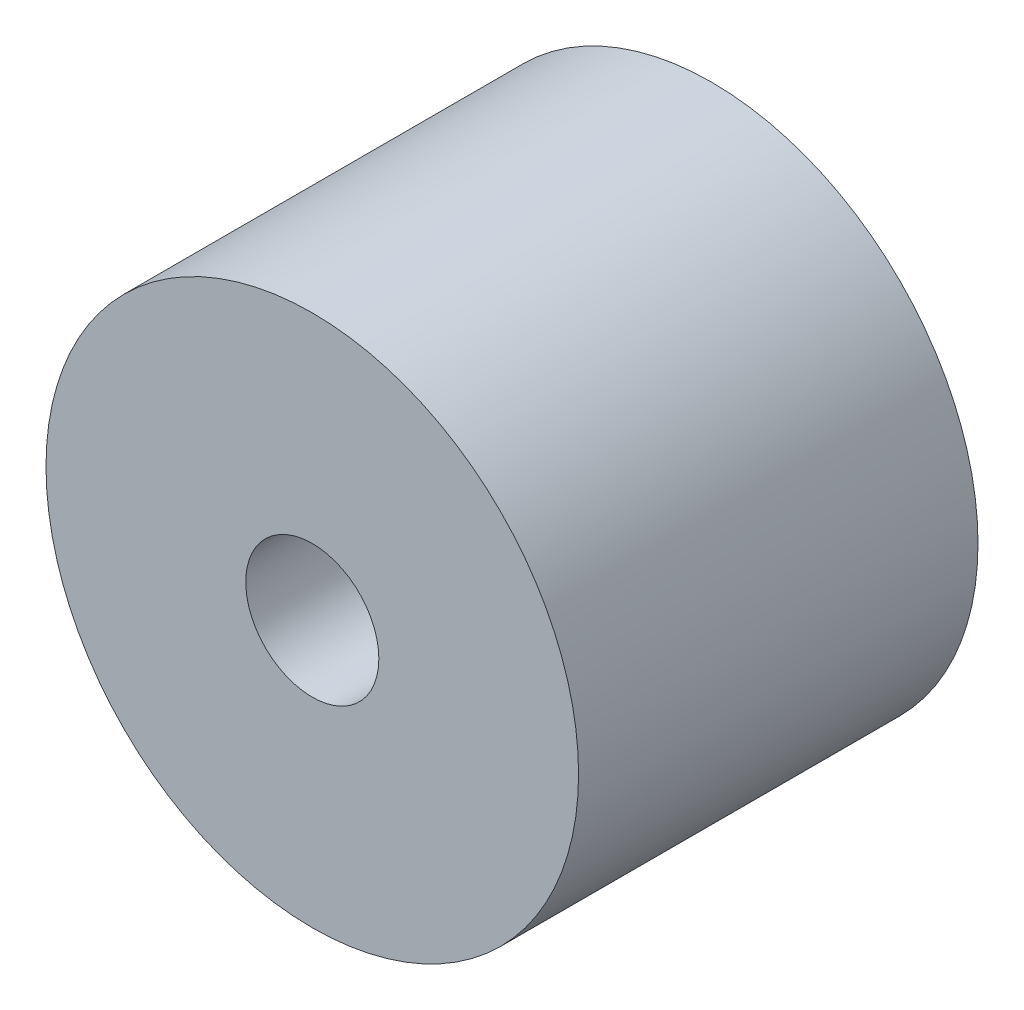
ISO-10303-21;
HEADER;
FILE_DESCRIPTION(('STEP AP214'),'2;1');
FILE_NAME('part.step','',(''),(''),'','','');
FILE_SCHEMA(('AUTOMOTIVE_DESIGN { 1 0 10303 214 1 1 1 1 }'));
ENDSEC;
DATA;
#1=APPLICATION_CONTEXT('core data for automotive mechanical design processes');
#2=APPLICATION_PROTOCOL_DEFINITION('international standard','automotive_design',2000,#1);
#3=PRODUCT_CONTEXT('',#1,'mechanical');
#4=PRODUCT('Part','Part','',(#3));
#5=PRODUCT_RELATED_PRODUCT_CATEGORY('part','',(#4));
#6=PRODUCT_DEFINITION_FORMATION('','',#4);
#7=PRODUCT_DEFINITION_CONTEXT('part definition',#1,'design');
#8=PRODUCT_DEFINITION('design','',#6,#7);
#9=PRODUCT_DEFINITION_SHAPE('','',#8);
#10=(LENGTH_UNIT() NAMED_UNIT(*) SI_UNIT(.MILLI.,.METRE.));
#11=(NAMED_UNIT(*) PLANE_ANGLE_UNIT() SI_UNIT($,.RADIAN.));
#12=(NAMED_UNIT(*) SI_UNIT($,.STERADIAN.) SOLID_ANGLE_UNIT());
#13=UNCERTAINTY_MEASURE_WITH_UNIT(LENGTH_MEASURE(1.E-05),#10,'distance_accuracy_value','');
#14=(GEOMETRIC_REPRESENTATION_CONTEXT(3) GLOBAL_UNCERTAINTY_ASSIGNED_CONTEXT((#13)) GLOBAL_UNIT_ASSIGNED_CONTEXT((#10,
#11,#12)) REPRESENTATION_CONTEXT('',''));
#15=CARTESIAN_POINT('',(0.,0.,0.));
#16=DIRECTION('',(0.,0.,1.));
#17=DIRECTION('',(1.,0.,0.));
#18=AXIS2_PLACEMENT_3D('',#15,#16,#17);
#19=CARTESIAN_POINT('',(0.,0.,150.));
#20=DIRECTION('',(0.,0.,-1.));
#21=DIRECTION('',(-1.,0.,0.));
#22=AXIS2_PLACEMENT_3D('',#19,#20,#21);
#23=CYLINDRICAL_SURFACE('',#22,100.);
#24=CARTESIAN_POINT('',(0.,0.,150.));
#25=DIRECTION('',(0.,0.,1.));
#26=DIRECTION('',(1.,0.,0.));
#27=AXIS2_PLACEMENT_3D('',#24,#25,#26);
#28=CIRCLE('',#27,100.);
#29=CARTESIAN_POINT('',(100.,0.,150.));
#30=VERTEX_POINT('',#29);
#31=EDGE_CURVE('E10',#30,#30,#28,.T.);
#32=ORIENTED_EDGE('',*,*,#31,.F.);
#33=EDGE_LOOP('',(#32));
#34=FACE_BOUND('',#33,.T.);
#35=CARTESIAN_POINT('',(0.,0.,0.));
#36=DIRECTION('',(0.,0.,1.));
#37=DIRECTION('',(1.,0.,0.));
#38=AXIS2_PLACEMENT_3D('',#35,#36,#37);
#39=CIRCLE('',#38,100.);
#40=CARTESIAN_POINT('',(100.,0.,0.));
#41=VERTEX_POINT('',#40);
#42=EDGE_CURVE('E37',#41,#41,#39,.T.);
#43=ORIENTED_EDGE('',*,*,#42,.T.);
#44=EDGE_LOOP('',(#43));
#45=FACE_BOUND('',#44,.T.);
#46=ADVANCED_FACE('F40',(#34,#45),#23,.T.);
#47=CARTESIAN_POINT('',(0.,0.,150.));
#48=DIRECTION('',(0.,0.,1.));
#49=DIRECTION('',(1.,0.,0.));
#50=AXIS2_PLACEMENT_3D('',#47,#48,#49);
#51=PLANE('',#50);
#52=CARTESIAN_POINT('',(0.,0.,150.));
#53=DIRECTION('',(0.,0.,1.));
#54=DIRECTION('',(1.,0.,0.));
#55=AXIS2_PLACEMENT_3D('',#52,#53,#54);
#56=CIRCLE('',#55,25.);
#57=CARTESIAN_POINT('',(25.,0.,150.));
#58=VERTEX_POINT('',#57);
#59=EDGE_CURVE('E47',#58,#58,#56,.T.);
#60=ORIENTED_EDGE('',*,*,#59,.F.);
#61=EDGE_LOOP('',(#60));
#62=FACE_BOUND('',#61,.T.);
#63=ORIENTED_EDGE('',*,*,#31,.T.);
#64=EDGE_LOOP('',(#63));
#65=FACE_BOUND('',#64,.T.);
#66=ADVANCED_FACE('F65',(#62,#65),#51,.T.);
#67=CARTESIAN_POINT('',(0.,0.,0.));
#68=DIRECTION('',(0.,0.,1.));
#69=DIRECTION('',(1.,0.,0.));
#70=AXIS2_PLACEMENT_3D('',#67,#68,#69);
#71=PLANE('',#70);
#72=ORIENTED_EDGE('',*,*,#42,.F.);
#73=EDGE_LOOP('',(#72));
#74=FACE_BOUND('',#73,.T.);
#75=ADVANCED_FACE('F58',(#74),#71,.F.);
#76=CARTESIAN_POINT('',(0.,0.,100.));
#77=DIRECTION('',(0.,0.,1.));
#78=DIRECTION('',(1.,0.,0.));
#79=AXIS2_PLACEMENT_3D('',#76,#77,#78);
#80=CYLINDRICAL_SURFACE('',#79,25.);
#81=CARTESIAN_POINT('',(0.,0.,100.));
#82=DIRECTION('',(0.,0.,1.));
#83=DIRECTION('',(1.,0.,0.));
#84=AXIS2_PLACEMENT_3D('',#81,#82,#83);
#85=CIRCLE('',#84,25.);
#86=CARTESIAN_POINT('',(25.,0.,100.));
#87=VERTEX_POINT('',#86);
#88=EDGE_CURVE('E50',#87,#87,#85,.T.);
#89=ORIENTED_EDGE('',*,*,#88,.F.);
#90=EDGE_LOOP('',(#89));
#91=FACE_BOUND('',#90,.T.);
#92=ORIENTED_EDGE('',*,*,#59,.T.);
#93=EDGE_LOOP('',(#92));
#94=FACE_BOUND('',#93,.T.);
#95=ADVANCED_FACE('F60',(#91,#94),#80,.F.);
#96=CARTESIAN_POINT('',(0.,0.,100.));
#97=DIRECTION('',(0.,0.,1.));
#98=DIRECTION('',(1.,0.,0.));
#99=AXIS2_PLACEMENT_3D('',#96,#97,#98);
#100=PLANE('',#99);
#101=ORIENTED_EDGE('',*,*,#88,.T.);
#102=EDGE_LOOP('',(#101));
#103=FACE_BOUND('',#102,.T.);
#104=ADVANCED_FACE('F54',(#103),#100,.T.);
#105=CLOSED_SHELL('',(#46,#66,#75,#95,#104));
#106=MANIFOLD_SOLID_BREP('B2',#105);
#107=ADVANCED_BREP_SHAPE_REPRESENTATION('',(#18,#106),#14);
#108=SHAPE_DEFINITION_REPRESENTATION(#9,#107);
ENDSEC;
END-ISO-10303-21;
